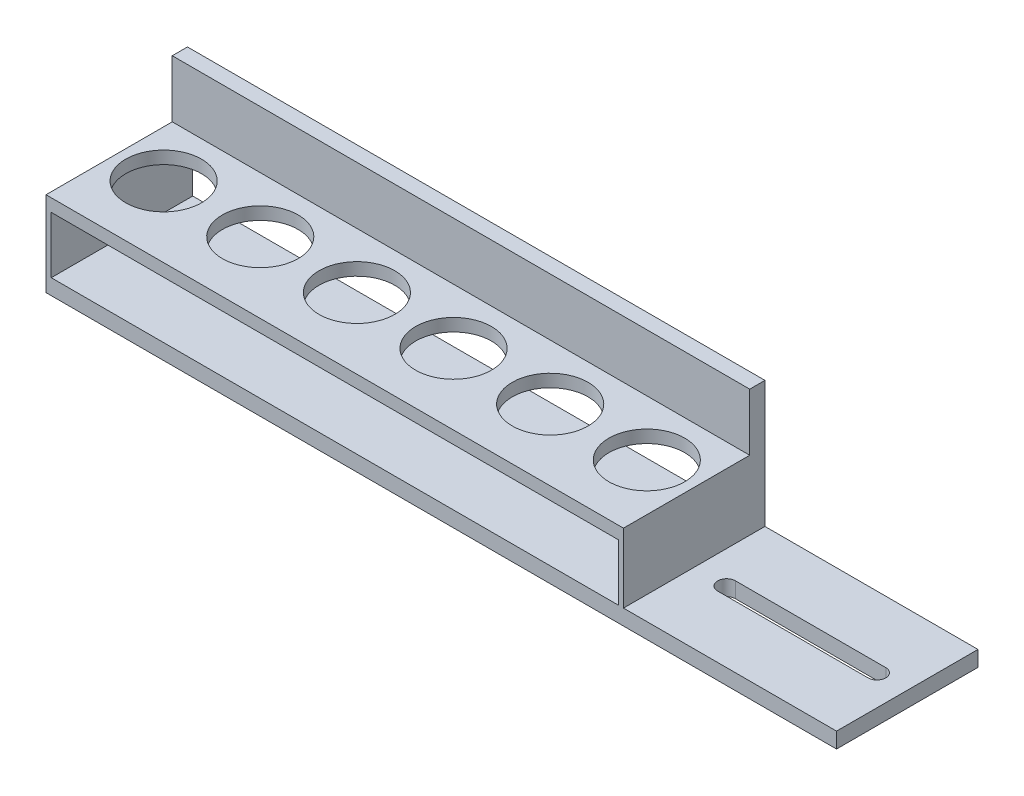
ISO-10303-21;
HEADER;
FILE_DESCRIPTION(('STEP AP214'),'2;1');
FILE_NAME('part.step','',(''),(''),'','','');
FILE_SCHEMA(('AUTOMOTIVE_DESIGN { 1 0 10303 214 1 1 1 1 }'));
ENDSEC;
DATA;
#1=APPLICATION_CONTEXT('core data for automotive mechanical design processes');
#2=APPLICATION_PROTOCOL_DEFINITION('international standard','automotive_design',2000,#1);
#3=PRODUCT_CONTEXT('',#1,'mechanical');
#4=PRODUCT('Part','Part','',(#3));
#5=PRODUCT_RELATED_PRODUCT_CATEGORY('part','',(#4));
#6=PRODUCT_DEFINITION_FORMATION('','',#4);
#7=PRODUCT_DEFINITION_CONTEXT('part definition',#1,'design');
#8=PRODUCT_DEFINITION('design','',#6,#7);
#9=PRODUCT_DEFINITION_SHAPE('','',#8);
#10=(LENGTH_UNIT() NAMED_UNIT(*) SI_UNIT(.MILLI.,.METRE.));
#11=(NAMED_UNIT(*) PLANE_ANGLE_UNIT() SI_UNIT($,.RADIAN.));
#12=(NAMED_UNIT(*) SI_UNIT($,.STERADIAN.) SOLID_ANGLE_UNIT());
#13=UNCERTAINTY_MEASURE_WITH_UNIT(LENGTH_MEASURE(1.E-05),#10,'distance_accuracy_value','');
#14=(GEOMETRIC_REPRESENTATION_CONTEXT(3) GLOBAL_UNCERTAINTY_ASSIGNED_CONTEXT((#13)) GLOBAL_UNIT_ASSIGNED_CONTEXT((#10,
#11,#12)) REPRESENTATION_CONTEXT('',''));
#15=CARTESIAN_POINT('',(0.,0.,0.));
#16=DIRECTION('',(0.,0.,1.));
#17=DIRECTION('',(1.,0.,0.));
#18=AXIS2_PLACEMENT_3D('',#15,#16,#17);
#19=CARTESIAN_POINT('',(0.,0.,55.99999976));
#20=DIRECTION('',(0.,1.,0.));
#21=DIRECTION('',(-1.,0.,0.));
#22=AXIS2_PLACEMENT_3D('',#19,#20,#21);
#23=PLANE('',#22);
#24=CARTESIAN_POINT('',(-210.039051384186,0.,27.99999988));
#25=DIRECTION('',(0.,1.,0.));
#26=DIRECTION('',(-1.,0.,0.));
#27=AXIS2_PLACEMENT_3D('',#24,#25,#26);
#28=CIRCLE('',#27,15.);
#29=CARTESIAN_POINT('',(-225.039051384186,0.,27.99999988));
#30=VERTEX_POINT('',#29);
#31=EDGE_CURVE('E37',#30,#30,#28,.T.);
#32=ORIENTED_EDGE('',*,*,#31,.T.);
#33=EDGE_LOOP('',(#32));
#34=FACE_BOUND('',#33,.T.);
#35=CARTESIAN_POINT('',(-171.783646654186,0.,27.99999988));
#36=DIRECTION('',(0.,1.,0.));
#37=DIRECTION('',(-1.,0.,0.));
#38=AXIS2_PLACEMENT_3D('',#35,#36,#37);
#39=CIRCLE('',#38,15.);
#40=CARTESIAN_POINT('',(-186.783646654186,0.,27.99999988));
#41=VERTEX_POINT('',#40);
#42=EDGE_CURVE('E303',#41,#41,#39,.T.);
#43=ORIENTED_EDGE('',*,*,#42,.T.);
#44=EDGE_LOOP('',(#43));
#45=FACE_BOUND('',#44,.T.);
#46=CARTESIAN_POINT('',(-133.528241924186,0.,27.99999988));
#47=DIRECTION('',(0.,1.,0.));
#48=DIRECTION('',(-1.,0.,0.));
#49=AXIS2_PLACEMENT_3D('',#46,#47,#48);
#50=CIRCLE('',#49,15.);
#51=CARTESIAN_POINT('',(-148.528241924186,0.,27.99999988));
#52=VERTEX_POINT('',#51);
#53=EDGE_CURVE('E301',#52,#52,#50,.T.);
#54=ORIENTED_EDGE('',*,*,#53,.T.);
#55=EDGE_LOOP('',(#54));
#56=FACE_BOUND('',#55,.T.);
#57=CARTESIAN_POINT('',(-95.2728371941859,0.,27.99999988));
#58=DIRECTION('',(0.,1.,0.));
#59=DIRECTION('',(-1.,0.,0.));
#60=AXIS2_PLACEMENT_3D('',#57,#58,#59);
#61=CIRCLE('',#60,15.);
#62=CARTESIAN_POINT('',(-110.272837194186,0.,27.99999988));
#63=VERTEX_POINT('',#62);
#64=EDGE_CURVE('E298',#63,#63,#61,.T.);
#65=ORIENTED_EDGE('',*,*,#64,.T.);
#66=EDGE_LOOP('',(#65));
#67=FACE_BOUND('',#66,.T.);
#68=CARTESIAN_POINT('',(-57.0174324641859,0.,27.99999988));
#69=DIRECTION('',(0.,1.,0.));
#70=DIRECTION('',(-1.,0.,0.));
#71=AXIS2_PLACEMENT_3D('',#68,#69,#70);
#72=CIRCLE('',#71,15.);
#73=CARTESIAN_POINT('',(-72.0174324641859,0.,27.99999988));
#74=VERTEX_POINT('',#73);
#75=EDGE_CURVE('E295',#74,#74,#72,.T.);
#76=ORIENTED_EDGE('',*,*,#75,.T.);
#77=EDGE_LOOP('',(#76));
#78=FACE_BOUND('',#77,.T.);
#79=CARTESIAN_POINT('',(-18.7620277341859,0.,27.99999988));
#80=DIRECTION('',(0.,1.,0.));
#81=DIRECTION('',(-1.,0.,0.));
#82=AXIS2_PLACEMENT_3D('',#79,#80,#81);
#83=CIRCLE('',#82,15.);
#84=CARTESIAN_POINT('',(-33.7620277341859,0.,27.99999988));
#85=VERTEX_POINT('',#84);
#86=EDGE_CURVE('E260',#85,#85,#83,.T.);
#87=ORIENTED_EDGE('',*,*,#86,.T.);
#88=EDGE_LOOP('',(#87));
#89=FACE_BOUND('',#88,.T.);
#90=DIRECTION('',(0.,0.,-1.));
#91=VECTOR('',#90,1.);
#92=CARTESIAN_POINT('',(-2.00486420188314,0.,0.));
#93=LINE('',#92,#91);
#94=CARTESIAN_POINT('',(-2.00486420188314,0.,55.99999976));
#95=VERTEX_POINT('',#94);
#96=CARTESIAN_POINT('',(-2.00486420188314,0.,0.));
#97=VERTEX_POINT('',#96);
#98=EDGE_CURVE('E209',#95,#97,#93,.T.);
#99=ORIENTED_EDGE('',*,*,#98,.F.);
#100=DIRECTION('',(1.,0.,0.));
#101=VECTOR('',#100,1.);
#102=CARTESIAN_POINT('',(0.,0.,55.99999976));
#103=LINE('',#102,#101);
#104=CARTESIAN_POINT('',(-226.522597964296,0.,55.99999976));
#105=VERTEX_POINT('',#104);
#106=EDGE_CURVE('E283',#105,#95,#103,.T.);
#107=ORIENTED_EDGE('',*,*,#106,.F.);
#108=DIRECTION('',(0.,0.,1.));
#109=VECTOR('',#108,1.);
#110=CARTESIAN_POINT('',(-226.522597964296,0.,55.99999976));
#111=LINE('',#110,#109);
#112=CARTESIAN_POINT('',(-226.522597964296,0.,0.));
#113=VERTEX_POINT('',#112);
#114=EDGE_CURVE('E224',#113,#105,#111,.T.);
#115=ORIENTED_EDGE('',*,*,#114,.F.);
#116=DIRECTION('',(1.,0.,0.));
#117=VECTOR('',#116,1.);
#118=CARTESIAN_POINT('',(0.,0.,0.));
#119=LINE('',#118,#117);
#120=EDGE_CURVE('E279',#113,#97,#119,.T.);
#121=ORIENTED_EDGE('',*,*,#120,.T.);
#122=EDGE_LOOP('',(#99,#107,#115,#121));
#123=FACE_BOUND('',#122,.T.);
#124=ADVANCED_FACE('F33',(#34,#45,#56,#67,#78,#89,#123),#23,.F.);
#125=CARTESIAN_POINT('',(0.,5.,55.99999976));
#126=DIRECTION('',(0.,-1.,0.));
#127=DIRECTION('',(1.,0.,0.));
#128=AXIS2_PLACEMENT_3D('',#125,#126,#127);
#129=PLANE('',#128);
#130=CARTESIAN_POINT('',(-18.7620277341859,5.,27.99999988));
#131=DIRECTION('',(0.,1.,0.));
#132=DIRECTION('',(-1.,0.,0.));
#133=AXIS2_PLACEMENT_3D('',#130,#131,#132);
#134=CIRCLE('',#133,15.);
#135=CARTESIAN_POINT('',(-33.7620277341859,5.,27.99999988));
#136=VERTEX_POINT('',#135);
#137=EDGE_CURVE('E256',#136,#136,#134,.T.);
#138=ORIENTED_EDGE('',*,*,#137,.F.);
#139=EDGE_LOOP('',(#138));
#140=FACE_BOUND('',#139,.T.);
#141=CARTESIAN_POINT('',(-57.0174324641859,4.99999999999999,27.99999988));
#142=DIRECTION('',(0.,1.,0.));
#143=DIRECTION('',(-1.,0.,0.));
#144=AXIS2_PLACEMENT_3D('',#141,#142,#143);
#145=CIRCLE('',#144,15.);
#146=CARTESIAN_POINT('',(-72.0174324641859,4.99999999999999,27.99999988));
#147=VERTEX_POINT('',#146);
#148=EDGE_CURVE('E270',#147,#147,#145,.T.);
#149=ORIENTED_EDGE('',*,*,#148,.F.);
#150=EDGE_LOOP('',(#149));
#151=FACE_BOUND('',#150,.T.);
#152=CARTESIAN_POINT('',(-95.2728371941859,4.99999999999999,27.99999988));
#153=DIRECTION('',(0.,1.,0.));
#154=DIRECTION('',(-1.,0.,0.));
#155=AXIS2_PLACEMENT_3D('',#152,#153,#154);
#156=CIRCLE('',#155,15.);
#157=CARTESIAN_POINT('',(-110.272837194186,4.99999999999999,27.99999988));
#158=VERTEX_POINT('',#157);
#159=EDGE_CURVE('E267',#158,#158,#156,.T.);
#160=ORIENTED_EDGE('',*,*,#159,.F.);
#161=EDGE_LOOP('',(#160));
#162=FACE_BOUND('',#161,.T.);
#163=CARTESIAN_POINT('',(-133.528241924186,4.99999999999998,27.99999988));
#164=DIRECTION('',(0.,1.,0.));
#165=DIRECTION('',(-1.,0.,0.));
#166=AXIS2_PLACEMENT_3D('',#163,#164,#165);
#167=CIRCLE('',#166,15.);
#168=CARTESIAN_POINT('',(-148.528241924186,4.99999999999998,27.99999988));
#169=VERTEX_POINT('',#168);
#170=EDGE_CURVE('E264',#169,#169,#167,.T.);
#171=ORIENTED_EDGE('',*,*,#170,.F.);
#172=EDGE_LOOP('',(#171));
#173=FACE_BOUND('',#172,.T.);
#174=CARTESIAN_POINT('',(-171.783646654186,4.99999999999998,27.99999988));
#175=DIRECTION('',(0.,1.,0.));
#176=DIRECTION('',(-1.,0.,0.));
#177=AXIS2_PLACEMENT_3D('',#174,#175,#176);
#178=CIRCLE('',#177,15.);
#179=CARTESIAN_POINT('',(-186.783646654186,4.99999999999998,27.99999988));
#180=VERTEX_POINT('',#179);
#181=EDGE_CURVE('E261',#180,#180,#178,.T.);
#182=ORIENTED_EDGE('',*,*,#181,.F.);
#183=EDGE_LOOP('',(#182));
#184=FACE_BOUND('',#183,.T.);
#185=CARTESIAN_POINT('',(-210.039051384186,4.99999999999997,27.99999988));
#186=DIRECTION('',(0.,1.,0.));
#187=DIRECTION('',(-1.,0.,0.));
#188=AXIS2_PLACEMENT_3D('',#185,#186,#187);
#189=CIRCLE('',#188,15.);
#190=CARTESIAN_POINT('',(-225.039051384186,4.99999999999997,27.99999988));
#191=VERTEX_POINT('',#190);
#192=EDGE_CURVE('E257',#191,#191,#189,.T.);
#193=ORIENTED_EDGE('',*,*,#192,.F.);
#194=EDGE_LOOP('',(#193));
#195=FACE_BOUND('',#194,.T.);
#196=DIRECTION('',(1.,0.,0.));
#197=VECTOR('',#196,1.);
#198=CARTESIAN_POINT('',(-228.6,4.99999999999997,6.02286139496498));
#199=LINE('',#198,#197);
#200=CARTESIAN_POINT('',(-228.6,4.99999999999997,6.02286139496498));
#201=VERTEX_POINT('',#200);
#202=CARTESIAN_POINT('',(0.,5.,6.02286139496498));
#203=VERTEX_POINT('',#202);
#204=EDGE_CURVE('E236',#201,#203,#199,.T.);
#205=ORIENTED_EDGE('',*,*,#204,.F.);
#206=DIRECTION('',(0.,0.,-1.));
#207=VECTOR('',#206,1.);
#208=CARTESIAN_POINT('',(-228.6,4.99999999999997,55.99999976));
#209=LINE('',#208,#207);
#210=CARTESIAN_POINT('',(-228.6,4.99999999999997,55.99999976));
#211=VERTEX_POINT('',#210);
#212=EDGE_CURVE('E42',#211,#201,#209,.T.);
#213=ORIENTED_EDGE('',*,*,#212,.F.);
#214=DIRECTION('',(-1.,0.,0.));
#215=VECTOR('',#214,1.);
#216=CARTESIAN_POINT('',(0.,5.,55.99999976));
#217=LINE('',#216,#215);
#218=CARTESIAN_POINT('',(0.,5.,55.99999976));
#219=VERTEX_POINT('',#218);
#220=EDGE_CURVE('E278',#219,#211,#217,.T.);
#221=ORIENTED_EDGE('',*,*,#220,.F.);
#222=DIRECTION('',(0.,0.,-1.));
#223=VECTOR('',#222,1.);
#224=CARTESIAN_POINT('',(0.,5.,55.99999976));
#225=LINE('',#224,#223);
#226=EDGE_CURVE('E11',#219,#203,#225,.T.);
#227=ORIENTED_EDGE('',*,*,#226,.T.);
#228=EDGE_LOOP('',(#205,#213,#221,#227));
#229=FACE_BOUND('',#228,.T.);
#230=ADVANCED_FACE('F328',(#140,#151,#162,#173,#184,#195,#229),#129,.F.);
#231=CARTESIAN_POINT('',(0.,0.,55.99999976));
#232=DIRECTION('',(-1.,0.,0.));
#233=DIRECTION('',(0.,0.,1.));
#234=AXIS2_PLACEMENT_3D('',#231,#232,#233);
#235=PLANE('',#234);
#236=DIRECTION('',(0.,1.,0.));
#237=VECTOR('',#236,1.);
#238=CARTESIAN_POINT('',(0.,0.,0.));
#239=LINE('',#238,#237);
#240=CARTESIAN_POINT('',(0.,-22.412,0.));
#241=VERTEX_POINT('',#240);
#242=CARTESIAN_POINT('',(0.,27.666,0.));
#243=VERTEX_POINT('',#242);
#244=EDGE_CURVE('E286',#241,#243,#239,.T.);
#245=ORIENTED_EDGE('',*,*,#244,.T.);
#246=DIRECTION('',(0.,0.,-1.));
#247=VECTOR('',#246,1.);
#248=CARTESIAN_POINT('',(0.,27.666,0.));
#249=LINE('',#248,#247);
#250=CARTESIAN_POINT('',(0.,27.666,6.02286139496498));
#251=VERTEX_POINT('',#250);
#252=EDGE_CURVE('E242',#251,#243,#249,.T.);
#253=ORIENTED_EDGE('',*,*,#252,.F.);
#254=DIRECTION('',(0.,-1.,0.));
#255=VECTOR('',#254,1.);
#256=CARTESIAN_POINT('',(0.,27.666,6.02286139496498));
#257=LINE('',#256,#255);
#258=EDGE_CURVE('E248',#251,#203,#257,.T.);
#259=ORIENTED_EDGE('',*,*,#258,.T.);
#260=ORIENTED_EDGE('',*,*,#226,.F.);
#261=DIRECTION('',(0.,1.,0.));
#262=VECTOR('',#261,1.);
#263=CARTESIAN_POINT('',(0.,0.,55.99999976));
#264=LINE('',#263,#262);
#265=CARTESIAN_POINT('',(0.,-22.412,55.99999976));
#266=VERTEX_POINT('',#265);
#267=EDGE_CURVE('E275',#266,#219,#264,.T.);
#268=ORIENTED_EDGE('',*,*,#267,.F.);
#269=DIRECTION('',(0.,0.,1.));
#270=VECTOR('',#269,1.);
#271=CARTESIAN_POINT('',(0.,-22.412,55.99999976));
#272=LINE('',#271,#270);
#273=EDGE_CURVE('E213',#241,#266,#272,.T.);
#274=ORIENTED_EDGE('',*,*,#273,.F.);
#275=EDGE_LOOP('',(#245,#253,#259,#260,#268,#274));
#276=FACE_BOUND('',#275,.T.);
#277=ADVANCED_FACE('F35',(#276),#235,.F.);
#278=CARTESIAN_POINT('',(-228.6,0.,55.99999976));
#279=DIRECTION('',(1.,0.,0.));
#280=DIRECTION('',(0.,0.,-1.));
#281=AXIS2_PLACEMENT_3D('',#278,#279,#280);
#282=PLANE('',#281);
#283=DIRECTION('',(0.,-1.,0.));
#284=VECTOR('',#283,1.);
#285=CARTESIAN_POINT('',(-228.6,0.,0.));
#286=LINE('',#285,#284);
#287=CARTESIAN_POINT('',(-228.6,27.666,0.));
#288=VERTEX_POINT('',#287);
#289=CARTESIAN_POINT('',(-228.6,-28.568,0.));
#290=VERTEX_POINT('',#289);
#291=EDGE_CURVE('E288',#288,#290,#286,.T.);
#292=ORIENTED_EDGE('',*,*,#291,.T.);
#293=DIRECTION('',(0.,0.,-1.));
#294=VECTOR('',#293,1.);
#295=CARTESIAN_POINT('',(-228.6,-28.568,55.99999976));
#296=LINE('',#295,#294);
#297=CARTESIAN_POINT('',(-228.6,-28.568,55.99999976));
#298=VERTEX_POINT('',#297);
#299=EDGE_CURVE('E187',#298,#290,#296,.T.);
#300=ORIENTED_EDGE('',*,*,#299,.F.);
#301=DIRECTION('',(0.,-1.,0.));
#302=VECTOR('',#301,1.);
#303=CARTESIAN_POINT('',(-228.6,0.,55.99999976));
#304=LINE('',#303,#302);
#305=EDGE_CURVE('E281',#211,#298,#304,.T.);
#306=ORIENTED_EDGE('',*,*,#305,.F.);
#307=ORIENTED_EDGE('',*,*,#212,.T.);
#308=DIRECTION('',(0.,-1.,0.));
#309=VECTOR('',#308,1.);
#310=CARTESIAN_POINT('',(-228.6,27.666,6.02286139496498));
#311=LINE('',#310,#309);
#312=CARTESIAN_POINT('',(-228.6,27.666,6.02286139496498));
#313=VERTEX_POINT('',#312);
#314=EDGE_CURVE('E253',#313,#201,#311,.T.);
#315=ORIENTED_EDGE('',*,*,#314,.F.);
#316=DIRECTION('',(0.,0.,1.));
#317=VECTOR('',#316,1.);
#318=CARTESIAN_POINT('',(-228.6,27.666,0.));
#319=LINE('',#318,#317);
#320=EDGE_CURVE('E237',#288,#313,#319,.T.);
#321=ORIENTED_EDGE('',*,*,#320,.F.);
#322=EDGE_LOOP('',(#292,#300,#306,#307,#315,#321));
#323=FACE_BOUND('',#322,.T.);
#324=ADVANCED_FACE('F338',(#323),#282,.F.);
#325=CARTESIAN_POINT('',(0.,0.,55.99999976));
#326=DIRECTION('',(0.,0.,1.));
#327=DIRECTION('',(1.,0.,0.));
#328=AXIS2_PLACEMENT_3D('',#325,#326,#327);
#329=PLANE('',#328);
#330=ORIENTED_EDGE('',*,*,#305,.T.);
#331=DIRECTION('',(-1.,0.,0.));
#332=VECTOR('',#331,1.);
#333=CARTESIAN_POINT('',(-226.522597964296,-28.568,55.99999976));
#334=LINE('',#333,#332);
#335=CARTESIAN_POINT('',(84.340152487016,-28.5679999999999,55.99999976));
#336=VERTEX_POINT('',#335);
#337=EDGE_CURVE('E184',#336,#298,#334,.T.);
#338=ORIENTED_EDGE('',*,*,#337,.F.);
#339=DIRECTION('',(0.,1.,0.));
#340=VECTOR('',#339,1.);
#341=CARTESIAN_POINT('',(84.340152487016,-28.5679999999999,55.99999976));
#342=LINE('',#341,#340);
#343=CARTESIAN_POINT('',(84.340152487016,-22.412,55.99999976));
#344=VERTEX_POINT('',#343);
#345=EDGE_CURVE('E196',#336,#344,#342,.T.);
#346=ORIENTED_EDGE('',*,*,#345,.T.);
#347=DIRECTION('',(-1.,0.,0.));
#348=VECTOR('',#347,1.);
#349=CARTESIAN_POINT('',(-226.522597964296,-22.412,55.99999976));
#350=LINE('',#349,#348);
#351=EDGE_CURVE('E188',#344,#266,#350,.T.);
#352=ORIENTED_EDGE('',*,*,#351,.T.);
#353=ORIENTED_EDGE('',*,*,#267,.T.);
#354=ORIENTED_EDGE('',*,*,#220,.T.);
#355=EDGE_LOOP('',(#330,#338,#346,#352,#353,#354));
#356=FACE_BOUND('',#355,.T.);
#357=CARTESIAN_POINT('',(-2.00486420188314,-22.412,55.99999976));
#358=VERTEX_POINT('',#357);
#359=CARTESIAN_POINT('',(-226.522597964296,-22.412,55.99999976));
#360=VERTEX_POINT('',#359);
#361=EDGE_CURVE('E201',#358,#360,#350,.T.);
#362=ORIENTED_EDGE('',*,*,#361,.T.);
#363=DIRECTION('',(0.,1.,0.));
#364=VECTOR('',#363,1.);
#365=CARTESIAN_POINT('',(-226.522597964296,-22.412,55.99999976));
#366=LINE('',#365,#364);
#367=EDGE_CURVE('E228',#360,#105,#366,.T.);
#368=ORIENTED_EDGE('',*,*,#367,.T.);
#369=ORIENTED_EDGE('',*,*,#106,.T.);
#370=DIRECTION('',(0.,1.,0.));
#371=VECTOR('',#370,1.);
#372=CARTESIAN_POINT('',(-2.00486420188314,-22.412,55.99999976));
#373=LINE('',#372,#371);
#374=EDGE_CURVE('E221',#358,#95,#373,.T.);
#375=ORIENTED_EDGE('',*,*,#374,.F.);
#376=EDGE_LOOP('',(#362,#368,#369,#375));
#377=FACE_BOUND('',#376,.T.);
#378=ADVANCED_FACE('F340',(#356,#377),#329,.T.);
#379=CARTESIAN_POINT('',(0.,0.,0.));
#380=DIRECTION('',(0.,0.,1.));
#381=DIRECTION('',(1.,0.,0.));
#382=AXIS2_PLACEMENT_3D('',#379,#380,#381);
#383=PLANE('',#382);
#384=DIRECTION('',(0.,1.,0.));
#385=VECTOR('',#384,1.);
#386=CARTESIAN_POINT('',(-226.522597964296,-22.412,0.));
#387=LINE('',#386,#385);
#388=CARTESIAN_POINT('',(-226.522597964296,-22.412,0.));
#389=VERTEX_POINT('',#388);
#390=EDGE_CURVE('E233',#389,#113,#387,.T.);
#391=ORIENTED_EDGE('',*,*,#390,.F.);
#392=DIRECTION('',(1.,0.,0.));
#393=VECTOR('',#392,1.);
#394=CARTESIAN_POINT('',(-226.522597964296,-22.412,0.));
#395=LINE('',#394,#393);
#396=CARTESIAN_POINT('',(-2.00486420188314,-22.412,0.));
#397=VERTEX_POINT('',#396);
#398=EDGE_CURVE('E198',#389,#397,#395,.T.);
#399=ORIENTED_EDGE('',*,*,#398,.T.);
#400=DIRECTION('',(0.,1.,0.));
#401=VECTOR('',#400,1.);
#402=CARTESIAN_POINT('',(-2.00486420188314,-22.412,0.));
#403=LINE('',#402,#401);
#404=EDGE_CURVE('E216',#397,#97,#403,.T.);
#405=ORIENTED_EDGE('',*,*,#404,.T.);
#406=ORIENTED_EDGE('',*,*,#120,.F.);
#407=EDGE_LOOP('',(#391,#399,#405,#406));
#408=FACE_BOUND('',#407,.T.);
#409=ORIENTED_EDGE('',*,*,#244,.F.);
#410=CARTESIAN_POINT('',(84.340152487016,-22.412,0.));
#411=VERTEX_POINT('',#410);
#412=EDGE_CURVE('E180',#241,#411,#395,.T.);
#413=ORIENTED_EDGE('',*,*,#412,.T.);
#414=DIRECTION('',(0.,1.,0.));
#415=VECTOR('',#414,1.);
#416=CARTESIAN_POINT('',(84.340152487016,-28.5679999999999,0.));
#417=LINE('',#416,#415);
#418=CARTESIAN_POINT('',(84.340152487016,-28.5679999999999,0.));
#419=VERTEX_POINT('',#418);
#420=EDGE_CURVE('E206',#419,#411,#417,.T.);
#421=ORIENTED_EDGE('',*,*,#420,.F.);
#422=DIRECTION('',(1.,0.,0.));
#423=VECTOR('',#422,1.);
#424=CARTESIAN_POINT('',(-228.6,-28.568,0.));
#425=LINE('',#424,#423);
#426=EDGE_CURVE('E191',#290,#419,#425,.T.);
#427=ORIENTED_EDGE('',*,*,#426,.F.);
#428=ORIENTED_EDGE('',*,*,#291,.F.);
#429=DIRECTION('',(-1.,0.,0.));
#430=VECTOR('',#429,1.);
#431=CARTESIAN_POINT('',(-228.6,27.666,0.));
#432=LINE('',#431,#430);
#433=EDGE_CURVE('E245',#243,#288,#432,.T.);
#434=ORIENTED_EDGE('',*,*,#433,.F.);
#435=EDGE_LOOP('',(#409,#413,#421,#427,#428,#434));
#436=FACE_BOUND('',#435,.T.);
#437=ADVANCED_FACE('F336',(#408,#436),#383,.F.);
#438=CARTESIAN_POINT('',(-18.7620277341859,-23.,27.99999988));
#439=DIRECTION('',(0.,1.,0.));
#440=DIRECTION('',(-1.,0.,0.));
#441=AXIS2_PLACEMENT_3D('',#438,#439,#440);
#442=CYLINDRICAL_SURFACE('',#441,15.);
#443=ORIENTED_EDGE('',*,*,#137,.T.);
#444=EDGE_LOOP('',(#443));
#445=FACE_BOUND('',#444,.T.);
#446=ORIENTED_EDGE('',*,*,#86,.F.);
#447=EDGE_LOOP('',(#446));
#448=FACE_BOUND('',#447,.T.);
#449=ADVANCED_FACE('F459',(#445,#448),#442,.F.);
#450=CARTESIAN_POINT('',(-57.0174324641859,-23.,27.99999988));
#451=DIRECTION('',(0.,1.,0.));
#452=DIRECTION('',(-1.,0.,0.));
#453=AXIS2_PLACEMENT_3D('',#450,#451,#452);
#454=CYLINDRICAL_SURFACE('',#453,15.);
#455=ORIENTED_EDGE('',*,*,#148,.T.);
#456=EDGE_LOOP('',(#455));
#457=FACE_BOUND('',#456,.T.);
#458=ORIENTED_EDGE('',*,*,#75,.F.);
#459=EDGE_LOOP('',(#458));
#460=FACE_BOUND('',#459,.T.);
#461=ADVANCED_FACE('F574',(#457,#460),#454,.F.);
#462=CARTESIAN_POINT('',(-95.2728371941859,-23.,27.99999988));
#463=DIRECTION('',(0.,1.,0.));
#464=DIRECTION('',(-1.,0.,0.));
#465=AXIS2_PLACEMENT_3D('',#462,#463,#464);
#466=CYLINDRICAL_SURFACE('',#465,15.);
#467=ORIENTED_EDGE('',*,*,#159,.T.);
#468=EDGE_LOOP('',(#467));
#469=FACE_BOUND('',#468,.T.);
#470=ORIENTED_EDGE('',*,*,#64,.F.);
#471=EDGE_LOOP('',(#470));
#472=FACE_BOUND('',#471,.T.);
#473=ADVANCED_FACE('F564',(#469,#472),#466,.F.);
#474=CARTESIAN_POINT('',(-133.528241924186,-23.,27.99999988));
#475=DIRECTION('',(0.,1.,0.));
#476=DIRECTION('',(-1.,0.,0.));
#477=AXIS2_PLACEMENT_3D('',#474,#475,#476);
#478=CYLINDRICAL_SURFACE('',#477,15.);
#479=ORIENTED_EDGE('',*,*,#170,.T.);
#480=EDGE_LOOP('',(#479));
#481=FACE_BOUND('',#480,.T.);
#482=ORIENTED_EDGE('',*,*,#53,.F.);
#483=EDGE_LOOP('',(#482));
#484=FACE_BOUND('',#483,.T.);
#485=ADVANCED_FACE('F324',(#481,#484),#478,.F.);
#486=CARTESIAN_POINT('',(-171.783646654186,-23.,27.99999988));
#487=DIRECTION('',(0.,1.,0.));
#488=DIRECTION('',(-1.,0.,0.));
#489=AXIS2_PLACEMENT_3D('',#486,#487,#488);
#490=CYLINDRICAL_SURFACE('',#489,15.);
#491=ORIENTED_EDGE('',*,*,#181,.T.);
#492=EDGE_LOOP('',(#491));
#493=FACE_BOUND('',#492,.T.);
#494=ORIENTED_EDGE('',*,*,#42,.F.);
#495=EDGE_LOOP('',(#494));
#496=FACE_BOUND('',#495,.T.);
#497=ADVANCED_FACE('F314',(#493,#496),#490,.F.);
#498=CARTESIAN_POINT('',(-210.039051384186,-23.,27.99999988));
#499=DIRECTION('',(0.,1.,0.));
#500=DIRECTION('',(-1.,0.,0.));
#501=AXIS2_PLACEMENT_3D('',#498,#499,#500);
#502=CYLINDRICAL_SURFACE('',#501,15.);
#503=ORIENTED_EDGE('',*,*,#192,.T.);
#504=EDGE_LOOP('',(#503));
#505=FACE_BOUND('',#504,.T.);
#506=ORIENTED_EDGE('',*,*,#31,.F.);
#507=EDGE_LOOP('',(#506));
#508=FACE_BOUND('',#507,.T.);
#509=ADVANCED_FACE('F311',(#505,#508),#502,.F.);
#510=CARTESIAN_POINT('',(-228.6,27.666,6.02286139496498));
#511=DIRECTION('',(0.,0.,-1.));
#512=DIRECTION('',(-1.,0.,0.));
#513=AXIS2_PLACEMENT_3D('',#510,#511,#512);
#514=PLANE('',#513);
#515=ORIENTED_EDGE('',*,*,#204,.T.);
#516=ORIENTED_EDGE('',*,*,#258,.F.);
#517=DIRECTION('',(1.,0.,0.));
#518=VECTOR('',#517,1.);
#519=CARTESIAN_POINT('',(-228.6,27.666,6.02286139496498));
#520=LINE('',#519,#518);
#521=EDGE_CURVE('E240',#313,#251,#520,.T.);
#522=ORIENTED_EDGE('',*,*,#521,.F.);
#523=ORIENTED_EDGE('',*,*,#314,.T.);
#524=EDGE_LOOP('',(#515,#516,#522,#523));
#525=FACE_BOUND('',#524,.T.);
#526=ADVANCED_FACE('F313',(#525),#514,.F.);
#527=CARTESIAN_POINT('',(0.,27.666,0.));
#528=DIRECTION('',(0.,1.,0.));
#529=DIRECTION('',(-1.,0.,0.));
#530=AXIS2_PLACEMENT_3D('',#527,#528,#529);
#531=PLANE('',#530);
#532=ORIENTED_EDGE('',*,*,#320,.T.);
#533=ORIENTED_EDGE('',*,*,#521,.T.);
#534=ORIENTED_EDGE('',*,*,#252,.T.);
#535=ORIENTED_EDGE('',*,*,#433,.T.);
#536=EDGE_LOOP('',(#532,#533,#534,#535));
#537=FACE_BOUND('',#536,.T.);
#538=ADVANCED_FACE('F321',(#537),#531,.T.);
#539=CARTESIAN_POINT('',(-226.522597964296,-22.412,55.99999976));
#540=DIRECTION('',(-1.,0.,0.));
#541=DIRECTION('',(0.,-1.,0.));
#542=AXIS2_PLACEMENT_3D('',#539,#540,#541);
#543=PLANE('',#542);
#544=ORIENTED_EDGE('',*,*,#114,.T.);
#545=ORIENTED_EDGE('',*,*,#367,.F.);
#546=DIRECTION('',(0.,0.,1.));
#547=VECTOR('',#546,1.);
#548=CARTESIAN_POINT('',(-226.522597964296,-22.412,55.99999976));
#549=LINE('',#548,#547);
#550=EDGE_CURVE('E225',#389,#360,#549,.T.);
#551=ORIENTED_EDGE('',*,*,#550,.F.);
#552=ORIENTED_EDGE('',*,*,#390,.T.);
#553=EDGE_LOOP('',(#544,#545,#551,#552));
#554=FACE_BOUND('',#553,.T.);
#555=ADVANCED_FACE('F374',(#554),#543,.F.);
#556=CARTESIAN_POINT('',(-2.00486420188314,-22.412,0.));
#557=DIRECTION('',(1.,0.,0.));
#558=DIRECTION('',(0.,1.,0.));
#559=AXIS2_PLACEMENT_3D('',#556,#557,#558);
#560=PLANE('',#559);
#561=ORIENTED_EDGE('',*,*,#98,.T.);
#562=ORIENTED_EDGE('',*,*,#404,.F.);
#563=DIRECTION('',(0.,0.,-1.));
#564=VECTOR('',#563,1.);
#565=CARTESIAN_POINT('',(-2.00486420188314,-22.412,0.));
#566=LINE('',#565,#564);
#567=EDGE_CURVE('E210',#358,#397,#566,.T.);
#568=ORIENTED_EDGE('',*,*,#567,.F.);
#569=ORIENTED_EDGE('',*,*,#374,.T.);
#570=EDGE_LOOP('',(#561,#562,#568,#569));
#571=FACE_BOUND('',#570,.T.);
#572=ADVANCED_FACE('F379',(#571),#560,.F.);
#573=CARTESIAN_POINT('',(0.,-22.412,0.));
#574=DIRECTION('',(0.,-1.,0.));
#575=DIRECTION('',(0.,0.,-1.));
#576=AXIS2_PLACEMENT_3D('',#573,#574,#575);
#577=PLANE('',#576);
#578=DIRECTION('',(-1.,0.,0.));
#579=VECTOR('',#578,1.);
#580=CARTESIAN_POINT('',(12.8104199773551,-22.412,31.5132783279285));
#581=LINE('',#580,#579);
#582=CARTESIAN_POINT('',(72.3366008747547,-22.412,31.5132783279285));
#583=VERTEX_POINT('',#582);
#584=CARTESIAN_POINT('',(12.8104199773551,-22.412,31.5132783279285));
#585=VERTEX_POINT('',#584);
#586=EDGE_CURVE('E155',#583,#585,#581,.T.);
#587=ORIENTED_EDGE('',*,*,#586,.T.);
#588=CARTESIAN_POINT('',(12.8104199773551,-22.412,27.99999988));
#589=DIRECTION('',(0.,-1.,0.));
#590=DIRECTION('',(0.,0.,-1.));
#591=AXIS2_PLACEMENT_3D('',#588,#589,#590);
#592=CIRCLE('',#591,3.51327844792855);
#593=CARTESIAN_POINT('',(12.8104199773551,-22.412,24.4867214320714));
#594=VERTEX_POINT('',#593);
#595=EDGE_CURVE('E149',#585,#594,#592,.T.);
#596=ORIENTED_EDGE('',*,*,#595,.T.);
#597=DIRECTION('',(1.,0.,0.));
#598=VECTOR('',#597,1.);
#599=CARTESIAN_POINT('',(72.3366008747547,-22.412,24.4867214320715));
#600=LINE('',#599,#598);
#601=CARTESIAN_POINT('',(72.3366008747547,-22.412,24.4867214320715));
#602=VERTEX_POINT('',#601);
#603=EDGE_CURVE('E158',#594,#602,#600,.T.);
#604=ORIENTED_EDGE('',*,*,#603,.T.);
#605=CARTESIAN_POINT('',(72.3366008747547,-22.412,27.99999988));
#606=DIRECTION('',(0.,-1.,0.));
#607=DIRECTION('',(0.,0.,-1.));
#608=AXIS2_PLACEMENT_3D('',#605,#606,#607);
#609=CIRCLE('',#608,3.51327844792855);
#610=EDGE_CURVE('E50',#602,#583,#609,.T.);
#611=ORIENTED_EDGE('',*,*,#610,.T.);
#612=EDGE_LOOP('',(#587,#596,#604,#611));
#613=FACE_BOUND('',#612,.T.);
#614=ORIENTED_EDGE('',*,*,#412,.F.);
#615=ORIENTED_EDGE('',*,*,#273,.T.);
#616=ORIENTED_EDGE('',*,*,#351,.F.);
#617=DIRECTION('',(0.,0.,1.));
#618=VECTOR('',#617,1.);
#619=CARTESIAN_POINT('',(84.340152487016,-22.412,55.99999976));
#620=LINE('',#619,#618);
#621=EDGE_CURVE('E199',#411,#344,#620,.T.);
#622=ORIENTED_EDGE('',*,*,#621,.F.);
#623=EDGE_LOOP('',(#614,#615,#616,#622));
#624=FACE_BOUND('',#623,.T.);
#625=ADVANCED_FACE('F162',(#613,#624),#577,.F.);
#626=ORIENTED_EDGE('',*,*,#398,.F.);
#627=ORIENTED_EDGE('',*,*,#550,.T.);
#628=ORIENTED_EDGE('',*,*,#361,.F.);
#629=ORIENTED_EDGE('',*,*,#567,.T.);
#630=EDGE_LOOP('',(#626,#627,#628,#629));
#631=FACE_BOUND('',#630,.T.);
#632=ADVANCED_FACE('F388',(#631),#577,.F.);
#633=CARTESIAN_POINT('',(84.340152487016,-28.5679999999999,55.99999976));
#634=DIRECTION('',(-1.,0.,0.));
#635=DIRECTION('',(0.,-1.,0.));
#636=AXIS2_PLACEMENT_3D('',#633,#634,#635);
#637=PLANE('',#636);
#638=ORIENTED_EDGE('',*,*,#621,.T.);
#639=ORIENTED_EDGE('',*,*,#345,.F.);
#640=DIRECTION('',(0.,0.,1.));
#641=VECTOR('',#640,1.);
#642=CARTESIAN_POINT('',(84.340152487016,-28.5679999999999,55.99999976));
#643=LINE('',#642,#641);
#644=EDGE_CURVE('E193',#419,#336,#643,.T.);
#645=ORIENTED_EDGE('',*,*,#644,.F.);
#646=ORIENTED_EDGE('',*,*,#420,.T.);
#647=EDGE_LOOP('',(#638,#639,#645,#646));
#648=FACE_BOUND('',#647,.T.);
#649=ADVANCED_FACE('F363',(#648),#637,.F.);
#650=CARTESIAN_POINT('',(0.,-28.568,0.));
#651=DIRECTION('',(0.,-1.,0.));
#652=DIRECTION('',(0.,0.,-1.));
#653=AXIS2_PLACEMENT_3D('',#650,#651,#652);
#654=PLANE('',#653);
#655=CARTESIAN_POINT('',(12.8104199773551,-28.568,27.99999988));
#656=DIRECTION('',(0.,-1.,0.));
#657=DIRECTION('',(0.,0.,-1.));
#658=AXIS2_PLACEMENT_3D('',#655,#656,#657);
#659=CIRCLE('',#658,3.51327844792855);
#660=CARTESIAN_POINT('',(12.8104199773551,-28.568,31.5132783279285));
#661=VERTEX_POINT('',#660);
#662=CARTESIAN_POINT('',(12.8104199773551,-28.568,24.4867214320714));
#663=VERTEX_POINT('',#662);
#664=EDGE_CURVE('E58',#661,#663,#659,.T.);
#665=ORIENTED_EDGE('',*,*,#664,.F.);
#666=DIRECTION('',(-1.,0.,0.));
#667=VECTOR('',#666,1.);
#668=CARTESIAN_POINT('',(12.8104199773551,-28.568,31.5132783279285));
#669=LINE('',#668,#667);
#670=CARTESIAN_POINT('',(72.3366008747547,-28.568,31.5132783279285));
#671=VERTEX_POINT('',#670);
#672=EDGE_CURVE('E165',#671,#661,#669,.T.);
#673=ORIENTED_EDGE('',*,*,#672,.F.);
#674=CARTESIAN_POINT('',(72.3366008747547,-28.568,27.99999988));
#675=DIRECTION('',(0.,-1.,0.));
#676=DIRECTION('',(0.,0.,-1.));
#677=AXIS2_PLACEMENT_3D('',#674,#675,#676);
#678=CIRCLE('',#677,3.51327844792855);
#679=CARTESIAN_POINT('',(72.3366008747547,-28.568,24.4867214320715));
#680=VERTEX_POINT('',#679);
#681=EDGE_CURVE('E168',#680,#671,#678,.T.);
#682=ORIENTED_EDGE('',*,*,#681,.F.);
#683=DIRECTION('',(1.,0.,0.));
#684=VECTOR('',#683,1.);
#685=CARTESIAN_POINT('',(72.3366008747547,-28.568,24.4867214320715));
#686=LINE('',#685,#684);
#687=EDGE_CURVE('E174',#663,#680,#686,.T.);
#688=ORIENTED_EDGE('',*,*,#687,.F.);
#689=EDGE_LOOP('',(#665,#673,#682,#688));
#690=FACE_BOUND('',#689,.T.);
#691=ORIENTED_EDGE('',*,*,#337,.T.);
#692=ORIENTED_EDGE('',*,*,#299,.T.);
#693=ORIENTED_EDGE('',*,*,#426,.T.);
#694=ORIENTED_EDGE('',*,*,#644,.T.);
#695=EDGE_LOOP('',(#691,#692,#693,#694));
#696=FACE_BOUND('',#695,.T.);
#697=ADVANCED_FACE('F356',(#690,#696),#654,.T.);
#698=CARTESIAN_POINT('',(12.8104199773551,-22.412,27.99999988));
#699=DIRECTION('',(0.,-1.,0.));
#700=DIRECTION('',(0.,0.,-1.));
#701=AXIS2_PLACEMENT_3D('',#698,#699,#700);
#702=CYLINDRICAL_SURFACE('',#701,3.51327844792855);
#703=ORIENTED_EDGE('',*,*,#664,.T.);
#704=DIRECTION('',(0.,-1.,0.));
#705=VECTOR('',#704,1.);
#706=CARTESIAN_POINT('',(12.8104199773551,-22.412,24.4867214320714));
#707=LINE('',#706,#705);
#708=EDGE_CURVE('E145',#594,#663,#707,.T.);
#709=ORIENTED_EDGE('',*,*,#708,.F.);
#710=ORIENTED_EDGE('',*,*,#595,.F.);
#711=DIRECTION('',(0.,-1.,0.));
#712=VECTOR('',#711,1.);
#713=CARTESIAN_POINT('',(12.8104199773551,-22.412,31.5132783279285));
#714=LINE('',#713,#712);
#715=EDGE_CURVE('E178',#585,#661,#714,.T.);
#716=ORIENTED_EDGE('',*,*,#715,.T.);
#717=EDGE_LOOP('',(#703,#709,#710,#716));
#718=FACE_BOUND('',#717,.T.);
#719=ADVANCED_FACE('F147',(#718),#702,.F.);
#720=CARTESIAN_POINT('',(12.8104199773551,-22.412,31.5132783279285));
#721=DIRECTION('',(0.,0.,1.));
#722=DIRECTION('',(1.,0.,0.));
#723=AXIS2_PLACEMENT_3D('',#720,#721,#722);
#724=PLANE('',#723);
#725=ORIENTED_EDGE('',*,*,#672,.T.);
#726=ORIENTED_EDGE('',*,*,#715,.F.);
#727=ORIENTED_EDGE('',*,*,#586,.F.);
#728=DIRECTION('',(0.,-1.,0.));
#729=VECTOR('',#728,1.);
#730=CARTESIAN_POINT('',(72.3366008747547,-22.412,31.5132783279285));
#731=LINE('',#730,#729);
#732=EDGE_CURVE('E181',#583,#671,#731,.T.);
#733=ORIENTED_EDGE('',*,*,#732,.T.);
#734=EDGE_LOOP('',(#725,#726,#727,#733));
#735=FACE_BOUND('',#734,.T.);
#736=ADVANCED_FACE('F396',(#735),#724,.F.);
#737=CARTESIAN_POINT('',(72.3366008747547,-22.412,27.99999988));
#738=DIRECTION('',(0.,-1.,0.));
#739=DIRECTION('',(0.,0.,-1.));
#740=AXIS2_PLACEMENT_3D('',#737,#738,#739);
#741=CYLINDRICAL_SURFACE('',#740,3.51327844792855);
#742=ORIENTED_EDGE('',*,*,#681,.T.);
#743=ORIENTED_EDGE('',*,*,#732,.F.);
#744=ORIENTED_EDGE('',*,*,#610,.F.);
#745=DIRECTION('',(0.,-1.,0.));
#746=VECTOR('',#745,1.);
#747=CARTESIAN_POINT('',(72.3366008747547,-22.412,24.4867214320715));
#748=LINE('',#747,#746);
#749=EDGE_CURVE('E154',#602,#680,#748,.T.);
#750=ORIENTED_EDGE('',*,*,#749,.T.);
#751=EDGE_LOOP('',(#742,#743,#744,#750));
#752=FACE_BOUND('',#751,.T.);
#753=ADVANCED_FACE('F399',(#752),#741,.F.);
#754=CARTESIAN_POINT('',(72.3366008747547,-22.412,24.4867214320715));
#755=DIRECTION('',(0.,0.,-1.));
#756=DIRECTION('',(-1.,0.,0.));
#757=AXIS2_PLACEMENT_3D('',#754,#755,#756);
#758=PLANE('',#757);
#759=ORIENTED_EDGE('',*,*,#687,.T.);
#760=ORIENTED_EDGE('',*,*,#749,.F.);
#761=ORIENTED_EDGE('',*,*,#603,.F.);
#762=ORIENTED_EDGE('',*,*,#708,.T.);
#763=EDGE_LOOP('',(#759,#760,#761,#762));
#764=FACE_BOUND('',#763,.T.);
#765=ADVANCED_FACE('F159',(#764),#758,.F.);
#766=CLOSED_SHELL('',(#124,#230,#277,#324,#378,#437,#449,#461,#473,#485,#497,#509,#526,#538,
#555,#572,#625,#632,#649,#697,#719,#736,#753,#765));
#767=MANIFOLD_SOLID_BREP('B2',#766);
#768=ADVANCED_BREP_SHAPE_REPRESENTATION('',(#18,#767),#14);
#769=SHAPE_DEFINITION_REPRESENTATION(#9,#768);
ENDSEC;
END-ISO-10303-21;
